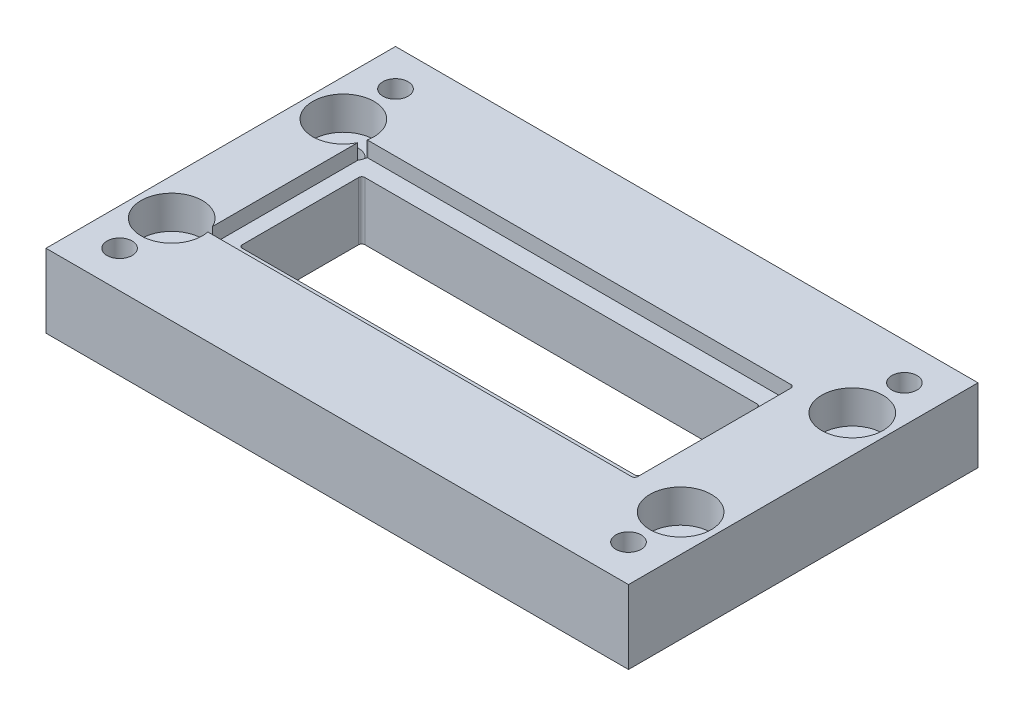
ISO-10303-21;
HEADER;
FILE_DESCRIPTION(('STEP AP214'),'2;1');
FILE_NAME('part.step','',(''),(''),'','','');
FILE_SCHEMA(('AUTOMOTIVE_DESIGN { 1 0 10303 214 1 1 1 1 }'));
ENDSEC;
DATA;
#1=APPLICATION_CONTEXT('core data for automotive mechanical design processes');
#2=APPLICATION_PROTOCOL_DEFINITION('international standard','automotive_design',2000,#1);
#3=PRODUCT_CONTEXT('',#1,'mechanical');
#4=PRODUCT('Part','Part','',(#3));
#5=PRODUCT_RELATED_PRODUCT_CATEGORY('part','',(#4));
#6=PRODUCT_DEFINITION_FORMATION('','',#4);
#7=PRODUCT_DEFINITION_CONTEXT('part definition',#1,'design');
#8=PRODUCT_DEFINITION('design','',#6,#7);
#9=PRODUCT_DEFINITION_SHAPE('','',#8);
#10=(LENGTH_UNIT() NAMED_UNIT(*) SI_UNIT(.MILLI.,.METRE.));
#11=(NAMED_UNIT(*) PLANE_ANGLE_UNIT() SI_UNIT($,.RADIAN.));
#12=(NAMED_UNIT(*) SI_UNIT($,.STERADIAN.) SOLID_ANGLE_UNIT());
#13=UNCERTAINTY_MEASURE_WITH_UNIT(LENGTH_MEASURE(1.E-05),#10,'distance_accuracy_value','');
#14=(GEOMETRIC_REPRESENTATION_CONTEXT(3) GLOBAL_UNCERTAINTY_ASSIGNED_CONTEXT((#13)) GLOBAL_UNIT_ASSIGNED_CONTEXT((#10,
#11,#12)) REPRESENTATION_CONTEXT('',''));
#15=CARTESIAN_POINT('',(0.,0.,0.));
#16=DIRECTION('',(0.,0.,1.));
#17=DIRECTION('',(1.,0.,0.));
#18=AXIS2_PLACEMENT_3D('',#15,#16,#17);
#19=CARTESIAN_POINT('',(-37.,12.,0.));
#20=DIRECTION('',(1.,0.,0.));
#21=DIRECTION('',(0.,0.,-1.));
#22=AXIS2_PLACEMENT_3D('',#19,#20,#21);
#23=PLANE('',#22);
#24=DIRECTION('',(0.,1.,0.));
#25=VECTOR('',#24,1.);
#26=CARTESIAN_POINT('',(-37.,12.,11.8205505282297));
#27=LINE('',#26,#25);
#28=CARTESIAN_POINT('',(-37.,9.5,11.8205505282297));
#29=VERTEX_POINT('',#28);
#30=CARTESIAN_POINT('',(-37.,12.,11.8205505282297));
#31=VERTEX_POINT('',#30);
#32=EDGE_CURVE('E65',#29,#31,#27,.T.);
#33=ORIENTED_EDGE('',*,*,#32,.F.);
#34=DIRECTION('',(0.,0.,1.));
#35=VECTOR('',#34,1.);
#36=CARTESIAN_POINT('',(-37.,9.5,0.));
#37=LINE('',#36,#35);
#38=CARTESIAN_POINT('',(-37.,9.5,-11.8205505282297));
#39=VERTEX_POINT('',#38);
#40=EDGE_CURVE('E352',#39,#29,#37,.T.);
#41=ORIENTED_EDGE('',*,*,#40,.F.);
#42=DIRECTION('',(0.,1.,0.));
#43=VECTOR('',#42,1.);
#44=CARTESIAN_POINT('',(-37.,12.,-11.8205505282297));
#45=LINE('',#44,#43);
#46=CARTESIAN_POINT('',(-37.,12.,-11.8205505282297));
#47=VERTEX_POINT('',#46);
#48=EDGE_CURVE('E58',#47,#39,#45,.F.);
#49=ORIENTED_EDGE('',*,*,#48,.F.);
#50=DIRECTION('',(0.,0.,1.));
#51=VECTOR('',#50,1.);
#52=CARTESIAN_POINT('',(-37.,12.,0.));
#53=LINE('',#52,#51);
#54=EDGE_CURVE('E429',#47,#31,#53,.T.);
#55=ORIENTED_EDGE('',*,*,#54,.T.);
#56=EDGE_LOOP('',(#33,#41,#49,#55));
#57=FACE_BOUND('',#56,.T.);
#58=ADVANCED_FACE('F49',(#57),#23,.T.);
#59=CARTESIAN_POINT('',(-36.5,12.,-12.5));
#60=DIRECTION('',(0.,-1.,0.));
#61=DIRECTION('',(0.,0.,-1.));
#62=AXIS2_PLACEMENT_3D('',#59,#60,#61);
#63=CYLINDRICAL_SURFACE('',#62,0.500000000000003);
#64=CARTESIAN_POINT('',(-36.5,12.,-12.5));
#65=DIRECTION('',(0.,1.,0.));
#66=DIRECTION('',(0.,0.,1.));
#67=AXIS2_PLACEMENT_3D('',#64,#65,#66);
#68=CIRCLE('',#67,0.500000000000003);
#69=CARTESIAN_POINT('',(-36.6032318616067,12.,-12.9892271279776));
#70=VERTEX_POINT('',#69);
#71=CARTESIAN_POINT('',(-36.5,12.,-13.));
#72=VERTEX_POINT('',#71);
#73=EDGE_CURVE('E431',#70,#72,#68,.F.);
#74=ORIENTED_EDGE('',*,*,#73,.F.);
#75=DIRECTION('',(0.,1.,0.));
#76=VECTOR('',#75,1.);
#77=CARTESIAN_POINT('',(-36.6032318616067,10.35,-12.9892271279776));
#78=LINE('',#77,#76);
#79=CARTESIAN_POINT('',(-36.6032318616067,9.5,-12.9892271279776));
#80=VERTEX_POINT('',#79);
#81=EDGE_CURVE('E73',#70,#80,#78,.F.);
#82=ORIENTED_EDGE('',*,*,#81,.T.);
#83=CARTESIAN_POINT('',(-36.5,9.5,-12.5));
#84=DIRECTION('',(0.,1.,0.));
#85=DIRECTION('',(0.,0.,1.));
#86=AXIS2_PLACEMENT_3D('',#83,#84,#85);
#87=CIRCLE('',#86,0.500000000000003);
#88=CARTESIAN_POINT('',(-36.5,9.5,-13.));
#89=VERTEX_POINT('',#88);
#90=EDGE_CURVE('E350',#80,#89,#87,.F.);
#91=ORIENTED_EDGE('',*,*,#90,.T.);
#92=DIRECTION('',(0.,-1.,0.));
#93=VECTOR('',#92,1.);
#94=CARTESIAN_POINT('',(-36.5,12.,-13.));
#95=LINE('',#94,#93);
#96=EDGE_CURVE('E269',#72,#89,#95,.T.);
#97=ORIENTED_EDGE('',*,*,#96,.F.);
#98=EDGE_LOOP('',(#74,#82,#91,#97));
#99=FACE_BOUND('',#98,.T.);
#100=ADVANCED_FACE('F464',(#99),#63,.F.);
#101=CARTESIAN_POINT('',(0.,12.,-13.));
#102=DIRECTION('',(0.,0.,1.));
#103=DIRECTION('',(1.,0.,0.));
#104=AXIS2_PLACEMENT_3D('',#101,#102,#103);
#105=PLANE('',#104);
#106=DIRECTION('',(-1.,0.,0.));
#107=VECTOR('',#106,1.);
#108=CARTESIAN_POINT('',(0.,9.5,-13.));
#109=LINE('',#108,#107);
#110=CARTESIAN_POINT('',(32.5,9.5,-13.));
#111=VERTEX_POINT('',#110);
#112=EDGE_CURVE('E367',#111,#89,#109,.T.);
#113=ORIENTED_EDGE('',*,*,#112,.F.);
#114=DIRECTION('',(0.,-1.,0.));
#115=VECTOR('',#114,1.);
#116=CARTESIAN_POINT('',(32.5,12.,-13.));
#117=LINE('',#116,#115);
#118=CARTESIAN_POINT('',(32.5,12.,-13.));
#119=VERTEX_POINT('',#118);
#120=EDGE_CURVE('E266',#119,#111,#117,.T.);
#121=ORIENTED_EDGE('',*,*,#120,.F.);
#122=DIRECTION('',(-1.,0.,0.));
#123=VECTOR('',#122,1.);
#124=CARTESIAN_POINT('',(0.,12.,-13.));
#125=LINE('',#124,#123);
#126=EDGE_CURVE('E433',#119,#72,#125,.T.);
#127=ORIENTED_EDGE('',*,*,#126,.T.);
#128=ORIENTED_EDGE('',*,*,#96,.T.);
#129=EDGE_LOOP('',(#113,#121,#127,#128));
#130=FACE_BOUND('',#129,.T.);
#131=ADVANCED_FACE('F457',(#130),#105,.T.);
#132=CARTESIAN_POINT('',(32.5,12.,-12.5));
#133=DIRECTION('',(0.,-1.,0.));
#134=DIRECTION('',(0.,0.,-1.));
#135=AXIS2_PLACEMENT_3D('',#132,#133,#134);
#136=CYLINDRICAL_SURFACE('',#135,0.5);
#137=ORIENTED_EDGE('',*,*,#120,.T.);
#138=CARTESIAN_POINT('',(32.5,9.5,-12.5));
#139=DIRECTION('',(0.,1.,0.));
#140=DIRECTION('',(0.,0.,1.));
#141=AXIS2_PLACEMENT_3D('',#138,#139,#140);
#142=CIRCLE('',#141,0.5);
#143=CARTESIAN_POINT('',(33.,9.5,-12.5));
#144=VERTEX_POINT('',#143);
#145=EDGE_CURVE('E364',#111,#144,#142,.F.);
#146=ORIENTED_EDGE('',*,*,#145,.T.);
#147=DIRECTION('',(0.,-1.,0.));
#148=VECTOR('',#147,1.);
#149=CARTESIAN_POINT('',(33.,12.,-12.5));
#150=LINE('',#149,#148);
#151=CARTESIAN_POINT('',(33.,12.,-12.5));
#152=VERTEX_POINT('',#151);
#153=EDGE_CURVE('E263',#152,#144,#150,.T.);
#154=ORIENTED_EDGE('',*,*,#153,.F.);
#155=CARTESIAN_POINT('',(32.5,12.,-12.5));
#156=DIRECTION('',(0.,1.,0.));
#157=DIRECTION('',(0.,0.,1.));
#158=AXIS2_PLACEMENT_3D('',#155,#156,#157);
#159=CIRCLE('',#158,0.5);
#160=EDGE_CURVE('E436',#119,#152,#159,.F.);
#161=ORIENTED_EDGE('',*,*,#160,.F.);
#162=EDGE_LOOP('',(#137,#146,#154,#161));
#163=FACE_BOUND('',#162,.T.);
#164=ADVANCED_FACE('F455',(#163),#136,.F.);
#165=CARTESIAN_POINT('',(33.,12.,0.));
#166=DIRECTION('',(1.,0.,0.));
#167=DIRECTION('',(0.,0.,-1.));
#168=AXIS2_PLACEMENT_3D('',#165,#166,#167);
#169=PLANE('',#168);
#170=ORIENTED_EDGE('',*,*,#153,.T.);
#171=DIRECTION('',(0.,0.,1.));
#172=VECTOR('',#171,1.);
#173=CARTESIAN_POINT('',(33.,9.5,0.));
#174=LINE('',#173,#172);
#175=CARTESIAN_POINT('',(33.,9.5,12.5));
#176=VERTEX_POINT('',#175);
#177=EDGE_CURVE('E361',#144,#176,#174,.T.);
#178=ORIENTED_EDGE('',*,*,#177,.T.);
#179=DIRECTION('',(0.,-1.,0.));
#180=VECTOR('',#179,1.);
#181=CARTESIAN_POINT('',(33.,12.,12.5));
#182=LINE('',#181,#180);
#183=CARTESIAN_POINT('',(33.,12.,12.5));
#184=VERTEX_POINT('',#183);
#185=EDGE_CURVE('E260',#184,#176,#182,.T.);
#186=ORIENTED_EDGE('',*,*,#185,.F.);
#187=DIRECTION('',(0.,0.,1.));
#188=VECTOR('',#187,1.);
#189=CARTESIAN_POINT('',(33.,12.,0.));
#190=LINE('',#189,#188);
#191=EDGE_CURVE('E439',#152,#184,#190,.T.);
#192=ORIENTED_EDGE('',*,*,#191,.F.);
#193=EDGE_LOOP('',(#170,#178,#186,#192));
#194=FACE_BOUND('',#193,.T.);
#195=ADVANCED_FACE('F449',(#194),#169,.F.);
#196=CARTESIAN_POINT('',(32.5,12.,12.5));
#197=DIRECTION('',(0.,-1.,0.));
#198=DIRECTION('',(0.,0.,-1.));
#199=AXIS2_PLACEMENT_3D('',#196,#197,#198);
#200=CYLINDRICAL_SURFACE('',#199,0.5);
#201=CARTESIAN_POINT('',(32.5,9.5,12.5));
#202=DIRECTION('',(0.,1.,0.));
#203=DIRECTION('',(0.,0.,1.));
#204=AXIS2_PLACEMENT_3D('',#201,#202,#203);
#205=CIRCLE('',#204,0.5);
#206=CARTESIAN_POINT('',(32.5,9.5,13.));
#207=VERTEX_POINT('',#206);
#208=EDGE_CURVE('E359',#207,#176,#205,.T.);
#209=ORIENTED_EDGE('',*,*,#208,.F.);
#210=DIRECTION('',(0.,-1.,0.));
#211=VECTOR('',#210,1.);
#212=CARTESIAN_POINT('',(32.5,12.,13.));
#213=LINE('',#212,#211);
#214=CARTESIAN_POINT('',(32.5,12.,13.));
#215=VERTEX_POINT('',#214);
#216=EDGE_CURVE('E256',#215,#207,#213,.T.);
#217=ORIENTED_EDGE('',*,*,#216,.F.);
#218=CARTESIAN_POINT('',(32.5,12.,12.5));
#219=DIRECTION('',(0.,1.,0.));
#220=DIRECTION('',(0.,0.,1.));
#221=AXIS2_PLACEMENT_3D('',#218,#219,#220);
#222=CIRCLE('',#221,0.5);
#223=EDGE_CURVE('E224',#215,#184,#222,.T.);
#224=ORIENTED_EDGE('',*,*,#223,.T.);
#225=ORIENTED_EDGE('',*,*,#185,.T.);
#226=EDGE_LOOP('',(#209,#217,#224,#225));
#227=FACE_BOUND('',#226,.T.);
#228=ADVANCED_FACE('F443',(#227),#200,.F.);
#229=CARTESIAN_POINT('',(0.,12.,13.));
#230=DIRECTION('',(0.,0.,1.));
#231=DIRECTION('',(1.,0.,0.));
#232=AXIS2_PLACEMENT_3D('',#229,#230,#231);
#233=PLANE('',#232);
#234=ORIENTED_EDGE('',*,*,#216,.T.);
#235=DIRECTION('',(-1.,0.,0.));
#236=VECTOR('',#235,1.);
#237=CARTESIAN_POINT('',(0.,9.5,13.));
#238=LINE('',#237,#236);
#239=CARTESIAN_POINT('',(-36.5,9.5,13.));
#240=VERTEX_POINT('',#239);
#241=EDGE_CURVE('E356',#207,#240,#238,.T.);
#242=ORIENTED_EDGE('',*,*,#241,.T.);
#243=DIRECTION('',(0.,-1.,0.));
#244=VECTOR('',#243,1.);
#245=CARTESIAN_POINT('',(-36.5,12.,13.));
#246=LINE('',#245,#244);
#247=CARTESIAN_POINT('',(-36.5,12.,13.));
#248=VERTEX_POINT('',#247);
#249=EDGE_CURVE('E254',#248,#240,#246,.T.);
#250=ORIENTED_EDGE('',*,*,#249,.F.);
#251=DIRECTION('',(-1.,0.,0.));
#252=VECTOR('',#251,1.);
#253=CARTESIAN_POINT('',(0.,12.,13.));
#254=LINE('',#253,#252);
#255=EDGE_CURVE('E218',#215,#248,#254,.T.);
#256=ORIENTED_EDGE('',*,*,#255,.F.);
#257=EDGE_LOOP('',(#234,#242,#250,#256));
#258=FACE_BOUND('',#257,.T.);
#259=ADVANCED_FACE('F470',(#258),#233,.F.);
#260=CARTESIAN_POINT('',(0.,12.,-28.5));
#261=DIRECTION('',(0.,0.,1.));
#262=DIRECTION('',(1.,0.,0.));
#263=AXIS2_PLACEMENT_3D('',#260,#261,#262);
#264=PLANE('',#263);
#265=DIRECTION('',(-1.,0.,0.));
#266=VECTOR('',#265,1.);
#267=CARTESIAN_POINT('',(0.,0.,-28.5));
#268=LINE('',#267,#266);
#269=CARTESIAN_POINT('',(47.5,0.,-28.5));
#270=VERTEX_POINT('',#269);
#271=CARTESIAN_POINT('',(-47.5,0.,-28.5));
#272=VERTEX_POINT('',#271);
#273=EDGE_CURVE('E241',#270,#272,#268,.T.);
#274=ORIENTED_EDGE('',*,*,#273,.T.);
#275=DIRECTION('',(0.,-1.,0.));
#276=VECTOR('',#275,1.);
#277=CARTESIAN_POINT('',(-47.5,12.,-28.5));
#278=LINE('',#277,#276);
#279=CARTESIAN_POINT('',(-47.5,12.,-28.5));
#280=VERTEX_POINT('',#279);
#281=EDGE_CURVE('E257',#280,#272,#278,.T.);
#282=ORIENTED_EDGE('',*,*,#281,.F.);
#283=DIRECTION('',(-1.,0.,0.));
#284=VECTOR('',#283,1.);
#285=CARTESIAN_POINT('',(0.,12.,-28.5));
#286=LINE('',#285,#284);
#287=CARTESIAN_POINT('',(47.5,12.,-28.5));
#288=VERTEX_POINT('',#287);
#289=EDGE_CURVE('E418',#288,#280,#286,.T.);
#290=ORIENTED_EDGE('',*,*,#289,.F.);
#291=DIRECTION('',(0.,-1.,0.));
#292=VECTOR('',#291,1.);
#293=CARTESIAN_POINT('',(47.5,12.,-28.5));
#294=LINE('',#293,#292);
#295=EDGE_CURVE('E220',#288,#270,#294,.T.);
#296=ORIENTED_EDGE('',*,*,#295,.T.);
#297=EDGE_LOOP('',(#274,#282,#290,#296));
#298=FACE_BOUND('',#297,.T.);
#299=ADVANCED_FACE('F472',(#298),#264,.F.);
#300=CARTESIAN_POINT('',(-47.5,12.,0.));
#301=DIRECTION('',(1.,0.,0.));
#302=DIRECTION('',(0.,0.,-1.));
#303=AXIS2_PLACEMENT_3D('',#300,#301,#302);
#304=PLANE('',#303);
#305=DIRECTION('',(0.,0.,1.));
#306=VECTOR('',#305,1.);
#307=CARTESIAN_POINT('',(-47.5,0.,0.));
#308=LINE('',#307,#306);
#309=CARTESIAN_POINT('',(-47.5,0.,28.5));
#310=VERTEX_POINT('',#309);
#311=EDGE_CURVE('E244',#272,#310,#308,.T.);
#312=ORIENTED_EDGE('',*,*,#311,.T.);
#313=DIRECTION('',(0.,-1.,0.));
#314=VECTOR('',#313,1.);
#315=CARTESIAN_POINT('',(-47.5,12.,28.5));
#316=LINE('',#315,#314);
#317=CARTESIAN_POINT('',(-47.5,12.,28.5));
#318=VERTEX_POINT('',#317);
#319=EDGE_CURVE('E274',#318,#310,#316,.T.);
#320=ORIENTED_EDGE('',*,*,#319,.F.);
#321=DIRECTION('',(0.,0.,1.));
#322=VECTOR('',#321,1.);
#323=CARTESIAN_POINT('',(-47.5,12.,0.));
#324=LINE('',#323,#322);
#325=EDGE_CURVE('E421',#280,#318,#324,.T.);
#326=ORIENTED_EDGE('',*,*,#325,.F.);
#327=ORIENTED_EDGE('',*,*,#281,.T.);
#328=EDGE_LOOP('',(#312,#320,#326,#327));
#329=FACE_BOUND('',#328,.T.);
#330=ADVANCED_FACE('F478',(#329),#304,.F.);
#331=CARTESIAN_POINT('',(0.,12.,28.5));
#332=DIRECTION('',(0.,0.,1.));
#333=DIRECTION('',(1.,0.,0.));
#334=AXIS2_PLACEMENT_3D('',#331,#332,#333);
#335=PLANE('',#334);
#336=DIRECTION('',(-1.,0.,0.));
#337=VECTOR('',#336,1.);
#338=CARTESIAN_POINT('',(0.,0.,28.5));
#339=LINE('',#338,#337);
#340=CARTESIAN_POINT('',(47.5,0.,28.5));
#341=VERTEX_POINT('',#340);
#342=EDGE_CURVE('E247',#341,#310,#339,.T.);
#343=ORIENTED_EDGE('',*,*,#342,.F.);
#344=DIRECTION('',(0.,-1.,0.));
#345=VECTOR('',#344,1.);
#346=CARTESIAN_POINT('',(47.5,12.,28.5));
#347=LINE('',#346,#345);
#348=CARTESIAN_POINT('',(47.5,12.,28.5));
#349=VERTEX_POINT('',#348);
#350=EDGE_CURVE('E222',#349,#341,#347,.T.);
#351=ORIENTED_EDGE('',*,*,#350,.F.);
#352=DIRECTION('',(-1.,0.,0.));
#353=VECTOR('',#352,1.);
#354=CARTESIAN_POINT('',(0.,12.,28.5));
#355=LINE('',#354,#353);
#356=EDGE_CURVE('E423',#349,#318,#355,.T.);
#357=ORIENTED_EDGE('',*,*,#356,.T.);
#358=ORIENTED_EDGE('',*,*,#319,.T.);
#359=EDGE_LOOP('',(#343,#351,#357,#358));
#360=FACE_BOUND('',#359,.T.);
#361=ADVANCED_FACE('F495',(#360),#335,.T.);
#362=CARTESIAN_POINT('',(47.5,12.,0.));
#363=DIRECTION('',(1.,0.,0.));
#364=DIRECTION('',(0.,0.,-1.));
#365=AXIS2_PLACEMENT_3D('',#362,#363,#364);
#366=PLANE('',#365);
#367=DIRECTION('',(0.,0.,1.));
#368=VECTOR('',#367,1.);
#369=CARTESIAN_POINT('',(47.5,0.,0.));
#370=LINE('',#369,#368);
#371=EDGE_CURVE('E250',#270,#341,#370,.T.);
#372=ORIENTED_EDGE('',*,*,#371,.F.);
#373=ORIENTED_EDGE('',*,*,#295,.F.);
#374=DIRECTION('',(0.,0.,1.));
#375=VECTOR('',#374,1.);
#376=CARTESIAN_POINT('',(47.5,12.,0.));
#377=LINE('',#376,#375);
#378=EDGE_CURVE('E426',#288,#349,#377,.T.);
#379=ORIENTED_EDGE('',*,*,#378,.T.);
#380=ORIENTED_EDGE('',*,*,#350,.T.);
#381=EDGE_LOOP('',(#372,#373,#379,#380));
#382=FACE_BOUND('',#381,.T.);
#383=ADVANCED_FACE('F491',(#382),#366,.T.);
#384=CARTESIAN_POINT('',(-41.5,12.,22.5));
#385=DIRECTION('',(0.,-1.,0.));
#386=DIRECTION('',(0.,0.,-1.));
#387=AXIS2_PLACEMENT_3D('',#384,#385,#386);
#388=CYLINDRICAL_SURFACE('',#387,2.05798302171012);
#389=CARTESIAN_POINT('',(-41.5,12.,22.5));
#390=DIRECTION('',(0.,1.,0.));
#391=DIRECTION('',(0.,0.,1.));
#392=AXIS2_PLACEMENT_3D('',#389,#390,#391);
#393=CIRCLE('',#392,2.05798302171012);
#394=CARTESIAN_POINT('',(-41.5,12.,24.5579830217101));
#395=VERTEX_POINT('',#394);
#396=EDGE_CURVE('E415',#395,#395,#393,.T.);
#397=ORIENTED_EDGE('',*,*,#396,.T.);
#398=EDGE_LOOP('',(#397));
#399=FACE_BOUND('',#398,.T.);
#400=CARTESIAN_POINT('',(-41.5,0.,22.5));
#401=DIRECTION('',(0.,1.,0.));
#402=DIRECTION('',(0.,0.,1.));
#403=AXIS2_PLACEMENT_3D('',#400,#401,#402);
#404=CIRCLE('',#403,2.05798302171012);
#405=CARTESIAN_POINT('',(-41.5,0.,24.5579830217101));
#406=VERTEX_POINT('',#405);
#407=EDGE_CURVE('E238',#406,#406,#404,.T.);
#408=ORIENTED_EDGE('',*,*,#407,.F.);
#409=EDGE_LOOP('',(#408));
#410=FACE_BOUND('',#409,.T.);
#411=ADVANCED_FACE('F494',(#399,#410),#388,.F.);
#412=CARTESIAN_POINT('',(41.5,12.,22.5));
#413=DIRECTION('',(0.,-1.,0.));
#414=DIRECTION('',(0.,0.,-1.));
#415=AXIS2_PLACEMENT_3D('',#412,#413,#414);
#416=CYLINDRICAL_SURFACE('',#415,2.05798302171012);
#417=CARTESIAN_POINT('',(41.5,12.,22.5));
#418=DIRECTION('',(0.,1.,0.));
#419=DIRECTION('',(0.,0.,1.));
#420=AXIS2_PLACEMENT_3D('',#417,#418,#419);
#421=CIRCLE('',#420,2.05798302171012);
#422=CARTESIAN_POINT('',(41.5,12.,24.5579830217101));
#423=VERTEX_POINT('',#422);
#424=EDGE_CURVE('E412',#423,#423,#421,.T.);
#425=ORIENTED_EDGE('',*,*,#424,.T.);
#426=EDGE_LOOP('',(#425));
#427=FACE_BOUND('',#426,.T.);
#428=CARTESIAN_POINT('',(41.5,0.,22.5));
#429=DIRECTION('',(0.,1.,0.));
#430=DIRECTION('',(0.,0.,1.));
#431=AXIS2_PLACEMENT_3D('',#428,#429,#430);
#432=CIRCLE('',#431,2.05798302171012);
#433=CARTESIAN_POINT('',(41.5,0.,24.5579830217101));
#434=VERTEX_POINT('',#433);
#435=EDGE_CURVE('E235',#434,#434,#432,.T.);
#436=ORIENTED_EDGE('',*,*,#435,.F.);
#437=EDGE_LOOP('',(#436));
#438=FACE_BOUND('',#437,.T.);
#439=ADVANCED_FACE('F505',(#427,#438),#416,.F.);
#440=CARTESIAN_POINT('',(-41.5,12.,-22.5));
#441=DIRECTION('',(0.,-1.,0.));
#442=DIRECTION('',(0.,0.,-1.));
#443=AXIS2_PLACEMENT_3D('',#440,#441,#442);
#444=CYLINDRICAL_SURFACE('',#443,2.05798302171012);
#445=CARTESIAN_POINT('',(-41.5,12.,-22.5));
#446=DIRECTION('',(0.,1.,0.));
#447=DIRECTION('',(0.,0.,1.));
#448=AXIS2_PLACEMENT_3D('',#445,#446,#447);
#449=CIRCLE('',#448,2.05798302171012);
#450=CARTESIAN_POINT('',(-41.5,12.,-20.4420169782899));
#451=VERTEX_POINT('',#450);
#452=EDGE_CURVE('E409',#451,#451,#449,.T.);
#453=ORIENTED_EDGE('',*,*,#452,.T.);
#454=EDGE_LOOP('',(#453));
#455=FACE_BOUND('',#454,.T.);
#456=CARTESIAN_POINT('',(-41.5,0.,-22.5));
#457=DIRECTION('',(0.,1.,0.));
#458=DIRECTION('',(0.,0.,1.));
#459=AXIS2_PLACEMENT_3D('',#456,#457,#458);
#460=CIRCLE('',#459,2.05798302171012);
#461=CARTESIAN_POINT('',(-41.5,0.,-20.4420169782899));
#462=VERTEX_POINT('',#461);
#463=EDGE_CURVE('E231',#462,#462,#460,.T.);
#464=ORIENTED_EDGE('',*,*,#463,.F.);
#465=EDGE_LOOP('',(#464));
#466=FACE_BOUND('',#465,.T.);
#467=ADVANCED_FACE('F508',(#455,#466),#444,.F.);
#468=CARTESIAN_POINT('',(41.5,12.,-22.5));
#469=DIRECTION('',(0.,-1.,0.));
#470=DIRECTION('',(0.,0.,-1.));
#471=AXIS2_PLACEMENT_3D('',#468,#469,#470);
#472=CYLINDRICAL_SURFACE('',#471,2.05798302171012);
#473=CARTESIAN_POINT('',(41.5,12.,-22.5));
#474=DIRECTION('',(0.,1.,0.));
#475=DIRECTION('',(0.,0.,1.));
#476=AXIS2_PLACEMENT_3D('',#473,#474,#475);
#477=CIRCLE('',#476,2.05798302171012);
#478=CARTESIAN_POINT('',(41.5,12.,-20.4420169782899));
#479=VERTEX_POINT('',#478);
#480=EDGE_CURVE('E253',#479,#479,#477,.T.);
#481=ORIENTED_EDGE('',*,*,#480,.T.);
#482=EDGE_LOOP('',(#481));
#483=FACE_BOUND('',#482,.T.);
#484=CARTESIAN_POINT('',(41.5,0.,-22.5));
#485=DIRECTION('',(0.,1.,0.));
#486=DIRECTION('',(0.,0.,1.));
#487=AXIS2_PLACEMENT_3D('',#484,#485,#486);
#488=CIRCLE('',#487,2.05798302171012);
#489=CARTESIAN_POINT('',(41.5,0.,-20.4420169782899));
#490=VERTEX_POINT('',#489);
#491=EDGE_CURVE('E228',#490,#490,#488,.T.);
#492=ORIENTED_EDGE('',*,*,#491,.F.);
#493=EDGE_LOOP('',(#492));
#494=FACE_BOUND('',#493,.T.);
#495=ADVANCED_FACE('F51',(#483,#494),#472,.F.);
#496=CARTESIAN_POINT('',(-36.5,12.,12.5));
#497=DIRECTION('',(0.,-1.,0.));
#498=DIRECTION('',(0.,0.,-1.));
#499=AXIS2_PLACEMENT_3D('',#496,#497,#498);
#500=CYLINDRICAL_SURFACE('',#499,0.5);
#501=CARTESIAN_POINT('',(-36.5,9.5,12.5));
#502=DIRECTION('',(0.,1.,0.));
#503=DIRECTION('',(0.,0.,1.));
#504=AXIS2_PLACEMENT_3D('',#501,#502,#503);
#505=CIRCLE('',#504,0.5);
#506=CARTESIAN_POINT('',(-36.6032318616067,9.5,12.9892271279776));
#507=VERTEX_POINT('',#506);
#508=EDGE_CURVE('E211',#240,#507,#505,.F.);
#509=ORIENTED_EDGE('',*,*,#508,.T.);
#510=DIRECTION('',(0.,1.,0.));
#511=VECTOR('',#510,1.);
#512=CARTESIAN_POINT('',(-36.6032318616067,10.35,12.9892271279776));
#513=LINE('',#512,#511);
#514=CARTESIAN_POINT('',(-36.6032318616067,12.,12.9892271279776));
#515=VERTEX_POINT('',#514);
#516=EDGE_CURVE('E199',#507,#515,#513,.T.);
#517=ORIENTED_EDGE('',*,*,#516,.T.);
#518=CARTESIAN_POINT('',(-36.5,12.,12.5));
#519=DIRECTION('',(0.,1.,0.));
#520=DIRECTION('',(0.,0.,1.));
#521=AXIS2_PLACEMENT_3D('',#518,#519,#520);
#522=CIRCLE('',#521,0.5);
#523=EDGE_CURVE('E209',#248,#515,#522,.F.);
#524=ORIENTED_EDGE('',*,*,#523,.F.);
#525=ORIENTED_EDGE('',*,*,#249,.T.);
#526=EDGE_LOOP('',(#509,#517,#524,#525));
#527=FACE_BOUND('',#526,.T.);
#528=ADVANCED_FACE('F207',(#527),#500,.F.);
#529=CARTESIAN_POINT('',(0.,12.,0.));
#530=DIRECTION('',(0.,1.,0.));
#531=DIRECTION('',(0.,0.,1.));
#532=AXIS2_PLACEMENT_3D('',#529,#530,#531);
#533=PLANE('',#532);
#534=CARTESIAN_POINT('',(41.5,12.,14.));
#535=DIRECTION('',(0.,1.,0.));
#536=DIRECTION('',(0.,0.,1.));
#537=AXIS2_PLACEMENT_3D('',#534,#535,#536);
#538=CIRCLE('',#537,5.);
#539=CARTESIAN_POINT('',(41.5,12.,19.));
#540=VERTEX_POINT('',#539);
#541=EDGE_CURVE('E284',#540,#540,#538,.T.);
#542=ORIENTED_EDGE('',*,*,#541,.F.);
#543=EDGE_LOOP('',(#542));
#544=FACE_BOUND('',#543,.T.);
#545=CARTESIAN_POINT('',(41.5,12.,-14.));
#546=DIRECTION('',(0.,1.,0.));
#547=DIRECTION('',(0.,0.,1.));
#548=AXIS2_PLACEMENT_3D('',#545,#546,#547);
#549=CIRCLE('',#548,5.);
#550=CARTESIAN_POINT('',(41.5,12.,-9.00000000000001));
#551=VERTEX_POINT('',#550);
#552=EDGE_CURVE('E283',#551,#551,#549,.T.);
#553=ORIENTED_EDGE('',*,*,#552,.F.);
#554=EDGE_LOOP('',(#553));
#555=FACE_BOUND('',#554,.T.);
#556=CARTESIAN_POINT('',(-41.5,12.,14.));
#557=DIRECTION('',(0.,1.,0.));
#558=DIRECTION('',(0.,0.,1.));
#559=AXIS2_PLACEMENT_3D('',#556,#557,#558);
#560=CIRCLE('',#559,5.);
#561=EDGE_CURVE('E13',#31,#515,#560,.T.);
#562=ORIENTED_EDGE('',*,*,#561,.F.);
#563=ORIENTED_EDGE('',*,*,#54,.F.);
#564=CARTESIAN_POINT('',(-41.5,12.,-14.));
#565=DIRECTION('',(0.,1.,0.));
#566=DIRECTION('',(0.,0.,1.));
#567=AXIS2_PLACEMENT_3D('',#564,#565,#566);
#568=CIRCLE('',#567,5.);
#569=EDGE_CURVE('E271',#70,#47,#568,.T.);
#570=ORIENTED_EDGE('',*,*,#569,.F.);
#571=ORIENTED_EDGE('',*,*,#73,.T.);
#572=ORIENTED_EDGE('',*,*,#126,.F.);
#573=ORIENTED_EDGE('',*,*,#160,.T.);
#574=ORIENTED_EDGE('',*,*,#191,.T.);
#575=ORIENTED_EDGE('',*,*,#223,.F.);
#576=ORIENTED_EDGE('',*,*,#255,.T.);
#577=ORIENTED_EDGE('',*,*,#523,.T.);
#578=EDGE_LOOP('',(#562,#563,#570,#571,#572,#573,#574,#575,#576,#577));
#579=FACE_BOUND('',#578,.T.);
#580=ORIENTED_EDGE('',*,*,#480,.F.);
#581=EDGE_LOOP('',(#580));
#582=FACE_BOUND('',#581,.T.);
#583=ORIENTED_EDGE('',*,*,#452,.F.);
#584=EDGE_LOOP('',(#583));
#585=FACE_BOUND('',#584,.T.);
#586=ORIENTED_EDGE('',*,*,#424,.F.);
#587=EDGE_LOOP('',(#586));
#588=FACE_BOUND('',#587,.T.);
#589=ORIENTED_EDGE('',*,*,#396,.F.);
#590=EDGE_LOOP('',(#589));
#591=FACE_BOUND('',#590,.T.);
#592=ORIENTED_EDGE('',*,*,#289,.T.);
#593=ORIENTED_EDGE('',*,*,#325,.T.);
#594=ORIENTED_EDGE('',*,*,#356,.F.);
#595=ORIENTED_EDGE('',*,*,#378,.F.);
#596=EDGE_LOOP('',(#592,#593,#594,#595));
#597=FACE_BOUND('',#596,.T.);
#598=ADVANCED_FACE('F214',(#544,#555,#579,#582,#585,#588,#591,#597),#533,.T.);
#599=CARTESIAN_POINT('',(0.,0.,0.));
#600=DIRECTION('',(0.,1.,0.));
#601=DIRECTION('',(0.,0.,1.));
#602=AXIS2_PLACEMENT_3D('',#599,#600,#601);
#603=PLANE('',#602);
#604=CARTESIAN_POINT('',(41.5,0.,-14.));
#605=DIRECTION('',(0.,1.,0.));
#606=DIRECTION('',(0.,0.,1.));
#607=AXIS2_PLACEMENT_3D('',#604,#605,#606);
#608=CIRCLE('',#607,2.5);
#609=CARTESIAN_POINT('',(41.5,0.,-11.5));
#610=VERTEX_POINT('',#609);
#611=EDGE_CURVE('E315',#610,#610,#608,.T.);
#612=ORIENTED_EDGE('',*,*,#611,.T.);
#613=EDGE_LOOP('',(#612));
#614=FACE_BOUND('',#613,.T.);
#615=CARTESIAN_POINT('',(41.5,0.,14.));
#616=DIRECTION('',(0.,1.,0.));
#617=DIRECTION('',(0.,0.,1.));
#618=AXIS2_PLACEMENT_3D('',#615,#616,#617);
#619=CIRCLE('',#618,2.5);
#620=CARTESIAN_POINT('',(41.5,0.,16.5));
#621=VERTEX_POINT('',#620);
#622=EDGE_CURVE('E320',#621,#621,#619,.T.);
#623=ORIENTED_EDGE('',*,*,#622,.T.);
#624=EDGE_LOOP('',(#623));
#625=FACE_BOUND('',#624,.T.);
#626=CARTESIAN_POINT('',(-41.5,0.,14.));
#627=DIRECTION('',(0.,1.,0.));
#628=DIRECTION('',(0.,0.,1.));
#629=AXIS2_PLACEMENT_3D('',#626,#627,#628);
#630=CIRCLE('',#629,2.5);
#631=CARTESIAN_POINT('',(-41.5,0.,16.5));
#632=VERTEX_POINT('',#631);
#633=EDGE_CURVE('E316',#632,#632,#630,.T.);
#634=ORIENTED_EDGE('',*,*,#633,.T.);
#635=EDGE_LOOP('',(#634));
#636=FACE_BOUND('',#635,.T.);
#637=CARTESIAN_POINT('',(-41.5,0.,-14.));
#638=DIRECTION('',(0.,1.,0.));
#639=DIRECTION('',(0.,0.,1.));
#640=AXIS2_PLACEMENT_3D('',#637,#638,#639);
#641=CIRCLE('',#640,2.5);
#642=CARTESIAN_POINT('',(-41.5,0.,-11.5));
#643=VERTEX_POINT('',#642);
#644=EDGE_CURVE('E319',#643,#643,#641,.T.);
#645=ORIENTED_EDGE('',*,*,#644,.T.);
#646=EDGE_LOOP('',(#645));
#647=FACE_BOUND('',#646,.T.);
#648=ORIENTED_EDGE('',*,*,#491,.T.);
#649=EDGE_LOOP('',(#648));
#650=FACE_BOUND('',#649,.T.);
#651=ORIENTED_EDGE('',*,*,#463,.T.);
#652=EDGE_LOOP('',(#651));
#653=FACE_BOUND('',#652,.T.);
#654=ORIENTED_EDGE('',*,*,#435,.T.);
#655=EDGE_LOOP('',(#654));
#656=FACE_BOUND('',#655,.T.);
#657=ORIENTED_EDGE('',*,*,#407,.T.);
#658=EDGE_LOOP('',(#657));
#659=FACE_BOUND('',#658,.T.);
#660=ORIENTED_EDGE('',*,*,#273,.F.);
#661=ORIENTED_EDGE('',*,*,#371,.T.);
#662=ORIENTED_EDGE('',*,*,#342,.T.);
#663=ORIENTED_EDGE('',*,*,#311,.F.);
#664=EDGE_LOOP('',(#660,#661,#662,#663));
#665=FACE_BOUND('',#664,.T.);
#666=CARTESIAN_POINT('',(30.,0.,9.49999999999999));
#667=DIRECTION('',(0.,1.,0.));
#668=DIRECTION('',(0.,0.,1.));
#669=AXIS2_PLACEMENT_3D('',#666,#667,#668);
#670=CIRCLE('',#669,0.5);
#671=CARTESIAN_POINT('',(30.,0.,9.99999999999999));
#672=VERTEX_POINT('',#671);
#673=CARTESIAN_POINT('',(30.5,0.,9.49999999999999));
#674=VERTEX_POINT('',#673);
#675=EDGE_CURVE('E327',#672,#674,#670,.T.);
#676=ORIENTED_EDGE('',*,*,#675,.T.);
#677=DIRECTION('',(0.,0.,-1.));
#678=VECTOR('',#677,1.);
#679=CARTESIAN_POINT('',(30.5,0.,0.));
#680=LINE('',#679,#678);
#681=CARTESIAN_POINT('',(30.5,0.,-9.5));
#682=VERTEX_POINT('',#681);
#683=EDGE_CURVE('E332',#674,#682,#680,.T.);
#684=ORIENTED_EDGE('',*,*,#683,.T.);
#685=CARTESIAN_POINT('',(30.,0.,-9.50000000000001));
#686=DIRECTION('',(0.,1.,0.));
#687=DIRECTION('',(0.,0.,1.));
#688=AXIS2_PLACEMENT_3D('',#685,#686,#687);
#689=CIRCLE('',#688,0.5);
#690=CARTESIAN_POINT('',(30.,0.,-10.));
#691=VERTEX_POINT('',#690);
#692=EDGE_CURVE('E386',#682,#691,#689,.T.);
#693=ORIENTED_EDGE('',*,*,#692,.T.);
#694=DIRECTION('',(-1.,0.,0.));
#695=VECTOR('',#694,1.);
#696=CARTESIAN_POINT('',(0.,0.,-10.));
#697=LINE('',#696,#695);
#698=CARTESIAN_POINT('',(-34.,0.,-10.));
#699=VERTEX_POINT('',#698);
#700=EDGE_CURVE('E383',#691,#699,#697,.T.);
#701=ORIENTED_EDGE('',*,*,#700,.T.);
#702=CARTESIAN_POINT('',(-34.,0.,-9.5));
#703=DIRECTION('',(0.,1.,0.));
#704=DIRECTION('',(0.,0.,1.));
#705=AXIS2_PLACEMENT_3D('',#702,#703,#704);
#706=CIRCLE('',#705,0.5);
#707=CARTESIAN_POINT('',(-34.5,0.,-9.49999999999999));
#708=VERTEX_POINT('',#707);
#709=EDGE_CURVE('E380',#699,#708,#706,.T.);
#710=ORIENTED_EDGE('',*,*,#709,.T.);
#711=DIRECTION('',(0.,0.,-1.));
#712=VECTOR('',#711,1.);
#713=CARTESIAN_POINT('',(-34.5,0.,0.));
#714=LINE('',#713,#712);
#715=CARTESIAN_POINT('',(-34.5,0.,9.5));
#716=VERTEX_POINT('',#715);
#717=EDGE_CURVE('E377',#716,#708,#714,.T.);
#718=ORIENTED_EDGE('',*,*,#717,.F.);
#719=CARTESIAN_POINT('',(-34.,0.,9.5));
#720=DIRECTION('',(0.,1.,0.));
#721=DIRECTION('',(0.,0.,1.));
#722=AXIS2_PLACEMENT_3D('',#719,#720,#721);
#723=CIRCLE('',#722,0.5);
#724=CARTESIAN_POINT('',(-34.,0.,10.));
#725=VERTEX_POINT('',#724);
#726=EDGE_CURVE('E375',#725,#716,#723,.F.);
#727=ORIENTED_EDGE('',*,*,#726,.F.);
#728=DIRECTION('',(-1.,0.,0.));
#729=VECTOR('',#728,1.);
#730=CARTESIAN_POINT('',(0.,0.,10.));
#731=LINE('',#730,#729);
#732=EDGE_CURVE('E373',#672,#725,#731,.T.);
#733=ORIENTED_EDGE('',*,*,#732,.F.);
#734=EDGE_LOOP('',(#676,#684,#693,#701,#710,#718,#727,#733));
#735=FACE_BOUND('',#734,.T.);
#736=ADVANCED_FACE('F520',(#614,#625,#636,#647,#650,#653,#656,#659,#665,#735),#603,.F.);
#737=CARTESIAN_POINT('',(30.,9.5,9.49999999999999));
#738=DIRECTION('',(0.,-1.,0.));
#739=DIRECTION('',(0.,0.,-1.));
#740=AXIS2_PLACEMENT_3D('',#737,#738,#739);
#741=CYLINDRICAL_SURFACE('',#740,0.5);
#742=ORIENTED_EDGE('',*,*,#675,.F.);
#743=DIRECTION('',(0.,-1.,0.));
#744=VECTOR('',#743,1.);
#745=CARTESIAN_POINT('',(30.,9.5,9.99999999999999));
#746=LINE('',#745,#744);
#747=CARTESIAN_POINT('',(30.,9.5,9.99999999999999));
#748=VERTEX_POINT('',#747);
#749=EDGE_CURVE('E232',#748,#672,#746,.T.);
#750=ORIENTED_EDGE('',*,*,#749,.F.);
#751=CARTESIAN_POINT('',(30.,9.5,9.49999999999999));
#752=DIRECTION('',(0.,1.,0.));
#753=DIRECTION('',(0.,0.,1.));
#754=AXIS2_PLACEMENT_3D('',#751,#752,#753);
#755=CIRCLE('',#754,0.5);
#756=CARTESIAN_POINT('',(30.5,9.5,9.49999999999999));
#757=VERTEX_POINT('',#756);
#758=EDGE_CURVE('E328',#748,#757,#755,.T.);
#759=ORIENTED_EDGE('',*,*,#758,.T.);
#760=DIRECTION('',(0.,-1.,0.));
#761=VECTOR('',#760,1.);
#762=CARTESIAN_POINT('',(30.5,9.5,9.49999999999999));
#763=LINE('',#762,#761);
#764=EDGE_CURVE('E370',#757,#674,#763,.T.);
#765=ORIENTED_EDGE('',*,*,#764,.T.);
#766=EDGE_LOOP('',(#742,#750,#759,#765));
#767=FACE_BOUND('',#766,.T.);
#768=ADVANCED_FACE('F523',(#767),#741,.F.);
#769=CARTESIAN_POINT('',(0.,9.5,10.));
#770=DIRECTION('',(0.,0.,1.));
#771=DIRECTION('',(1.,0.,0.));
#772=AXIS2_PLACEMENT_3D('',#769,#770,#771);
#773=PLANE('',#772);
#774=ORIENTED_EDGE('',*,*,#732,.T.);
#775=DIRECTION('',(0.,-1.,0.));
#776=VECTOR('',#775,1.);
#777=CARTESIAN_POINT('',(-34.,9.5,10.));
#778=LINE('',#777,#776);
#779=CARTESIAN_POINT('',(-34.,9.5,10.));
#780=VERTEX_POINT('',#779);
#781=EDGE_CURVE('E403',#780,#725,#778,.T.);
#782=ORIENTED_EDGE('',*,*,#781,.F.);
#783=DIRECTION('',(-1.,0.,0.));
#784=VECTOR('',#783,1.);
#785=CARTESIAN_POINT('',(0.,9.5,10.));
#786=LINE('',#785,#784);
#787=EDGE_CURVE('E331',#748,#780,#786,.T.);
#788=ORIENTED_EDGE('',*,*,#787,.F.);
#789=ORIENTED_EDGE('',*,*,#749,.T.);
#790=EDGE_LOOP('',(#774,#782,#788,#789));
#791=FACE_BOUND('',#790,.T.);
#792=ADVANCED_FACE('F565',(#791),#773,.F.);
#793=CARTESIAN_POINT('',(-34.,9.5,9.5));
#794=DIRECTION('',(0.,-1.,0.));
#795=DIRECTION('',(0.,0.,-1.));
#796=AXIS2_PLACEMENT_3D('',#793,#794,#795);
#797=CYLINDRICAL_SURFACE('',#796,0.5);
#798=ORIENTED_EDGE('',*,*,#726,.T.);
#799=DIRECTION('',(0.,-1.,0.));
#800=VECTOR('',#799,1.);
#801=CARTESIAN_POINT('',(-34.5,9.5,9.5));
#802=LINE('',#801,#800);
#803=CARTESIAN_POINT('',(-34.5,9.5,9.5));
#804=VERTEX_POINT('',#803);
#805=EDGE_CURVE('E400',#804,#716,#802,.T.);
#806=ORIENTED_EDGE('',*,*,#805,.F.);
#807=CARTESIAN_POINT('',(-34.,9.5,9.5));
#808=DIRECTION('',(0.,1.,0.));
#809=DIRECTION('',(0.,0.,1.));
#810=AXIS2_PLACEMENT_3D('',#807,#808,#809);
#811=CIRCLE('',#810,0.5);
#812=EDGE_CURVE('E334',#780,#804,#811,.F.);
#813=ORIENTED_EDGE('',*,*,#812,.F.);
#814=ORIENTED_EDGE('',*,*,#781,.T.);
#815=EDGE_LOOP('',(#798,#806,#813,#814));
#816=FACE_BOUND('',#815,.T.);
#817=ADVANCED_FACE('F560',(#816),#797,.F.);
#818=CARTESIAN_POINT('',(-34.5,9.5,0.));
#819=DIRECTION('',(-1.,0.,0.));
#820=DIRECTION('',(0.,0.,1.));
#821=AXIS2_PLACEMENT_3D('',#818,#819,#820);
#822=PLANE('',#821);
#823=ORIENTED_EDGE('',*,*,#717,.T.);
#824=DIRECTION('',(0.,-1.,0.));
#825=VECTOR('',#824,1.);
#826=CARTESIAN_POINT('',(-34.5,9.5,-9.49999999999999));
#827=LINE('',#826,#825);
#828=CARTESIAN_POINT('',(-34.5,9.5,-9.49999999999999));
#829=VERTEX_POINT('',#828);
#830=EDGE_CURVE('E398',#829,#708,#827,.T.);
#831=ORIENTED_EDGE('',*,*,#830,.F.);
#832=DIRECTION('',(0.,0.,-1.));
#833=VECTOR('',#832,1.);
#834=CARTESIAN_POINT('',(-34.5,9.5,0.));
#835=LINE('',#834,#833);
#836=EDGE_CURVE('E336',#804,#829,#835,.T.);
#837=ORIENTED_EDGE('',*,*,#836,.F.);
#838=ORIENTED_EDGE('',*,*,#805,.T.);
#839=EDGE_LOOP('',(#823,#831,#837,#838));
#840=FACE_BOUND('',#839,.T.);
#841=ADVANCED_FACE('F557',(#840),#822,.F.);
#842=CARTESIAN_POINT('',(-34.,9.5,-9.5));
#843=DIRECTION('',(0.,-1.,0.));
#844=DIRECTION('',(0.,0.,-1.));
#845=AXIS2_PLACEMENT_3D('',#842,#843,#844);
#846=CYLINDRICAL_SURFACE('',#845,0.5);
#847=ORIENTED_EDGE('',*,*,#709,.F.);
#848=DIRECTION('',(0.,-1.,0.));
#849=VECTOR('',#848,1.);
#850=CARTESIAN_POINT('',(-34.,9.5,-10.));
#851=LINE('',#850,#849);
#852=CARTESIAN_POINT('',(-34.,9.5,-10.));
#853=VERTEX_POINT('',#852);
#854=EDGE_CURVE('E396',#853,#699,#851,.T.);
#855=ORIENTED_EDGE('',*,*,#854,.F.);
#856=CARTESIAN_POINT('',(-34.,9.5,-9.5));
#857=DIRECTION('',(0.,1.,0.));
#858=DIRECTION('',(0.,0.,1.));
#859=AXIS2_PLACEMENT_3D('',#856,#857,#858);
#860=CIRCLE('',#859,0.5);
#861=EDGE_CURVE('E338',#853,#829,#860,.T.);
#862=ORIENTED_EDGE('',*,*,#861,.T.);
#863=ORIENTED_EDGE('',*,*,#830,.T.);
#864=EDGE_LOOP('',(#847,#855,#862,#863));
#865=FACE_BOUND('',#864,.T.);
#866=ADVANCED_FACE('F553',(#865),#846,.F.);
#867=CARTESIAN_POINT('',(0.,9.5,-10.));
#868=DIRECTION('',(0.,0.,1.));
#869=DIRECTION('',(1.,0.,0.));
#870=AXIS2_PLACEMENT_3D('',#867,#868,#869);
#871=PLANE('',#870);
#872=ORIENTED_EDGE('',*,*,#700,.F.);
#873=DIRECTION('',(0.,-1.,0.));
#874=VECTOR('',#873,1.);
#875=CARTESIAN_POINT('',(30.,9.5,-10.));
#876=LINE('',#875,#874);
#877=CARTESIAN_POINT('',(30.,9.5,-10.));
#878=VERTEX_POINT('',#877);
#879=EDGE_CURVE('E394',#878,#691,#876,.T.);
#880=ORIENTED_EDGE('',*,*,#879,.F.);
#881=DIRECTION('',(-1.,0.,0.));
#882=VECTOR('',#881,1.);
#883=CARTESIAN_POINT('',(0.,9.5,-10.));
#884=LINE('',#883,#882);
#885=EDGE_CURVE('E341',#878,#853,#884,.T.);
#886=ORIENTED_EDGE('',*,*,#885,.T.);
#887=ORIENTED_EDGE('',*,*,#854,.T.);
#888=EDGE_LOOP('',(#872,#880,#886,#887));
#889=FACE_BOUND('',#888,.T.);
#890=ADVANCED_FACE('F549',(#889),#871,.T.);
#891=CARTESIAN_POINT('',(30.,9.5,-9.50000000000001));
#892=DIRECTION('',(0.,-1.,0.));
#893=DIRECTION('',(0.,0.,-1.));
#894=AXIS2_PLACEMENT_3D('',#891,#892,#893);
#895=CYLINDRICAL_SURFACE('',#894,0.5);
#896=ORIENTED_EDGE('',*,*,#692,.F.);
#897=DIRECTION('',(0.,-1.,0.));
#898=VECTOR('',#897,1.);
#899=CARTESIAN_POINT('',(30.5,9.5,-9.5));
#900=LINE('',#899,#898);
#901=CARTESIAN_POINT('',(30.5,9.5,-9.5));
#902=VERTEX_POINT('',#901);
#903=EDGE_CURVE('E392',#902,#682,#900,.T.);
#904=ORIENTED_EDGE('',*,*,#903,.F.);
#905=CARTESIAN_POINT('',(30.,9.5,-9.50000000000001));
#906=DIRECTION('',(0.,1.,0.));
#907=DIRECTION('',(0.,0.,1.));
#908=AXIS2_PLACEMENT_3D('',#905,#906,#907);
#909=CIRCLE('',#908,0.5);
#910=EDGE_CURVE('E344',#902,#878,#909,.T.);
#911=ORIENTED_EDGE('',*,*,#910,.T.);
#912=ORIENTED_EDGE('',*,*,#879,.T.);
#913=EDGE_LOOP('',(#896,#904,#911,#912));
#914=FACE_BOUND('',#913,.T.);
#915=ADVANCED_FACE('F544',(#914),#895,.F.);
#916=CARTESIAN_POINT('',(30.5,9.5,0.));
#917=DIRECTION('',(-1.,0.,0.));
#918=DIRECTION('',(0.,0.,1.));
#919=AXIS2_PLACEMENT_3D('',#916,#917,#918);
#920=PLANE('',#919);
#921=ORIENTED_EDGE('',*,*,#683,.F.);
#922=ORIENTED_EDGE('',*,*,#764,.F.);
#923=DIRECTION('',(0.,0.,-1.));
#924=VECTOR('',#923,1.);
#925=CARTESIAN_POINT('',(30.5,9.5,0.));
#926=LINE('',#925,#924);
#927=EDGE_CURVE('E347',#757,#902,#926,.T.);
#928=ORIENTED_EDGE('',*,*,#927,.T.);
#929=ORIENTED_EDGE('',*,*,#903,.T.);
#930=EDGE_LOOP('',(#921,#922,#928,#929));
#931=FACE_BOUND('',#930,.T.);
#932=ADVANCED_FACE('F539',(#931),#920,.T.);
#933=CARTESIAN_POINT('',(0.,9.5,0.));
#934=DIRECTION('',(0.,1.,0.));
#935=DIRECTION('',(0.,0.,1.));
#936=AXIS2_PLACEMENT_3D('',#933,#934,#935);
#937=PLANE('',#936);
#938=CARTESIAN_POINT('',(-41.5,9.5,14.));
#939=DIRECTION('',(0.,1.,0.));
#940=DIRECTION('',(0.,0.,1.));
#941=AXIS2_PLACEMENT_3D('',#938,#939,#940);
#942=CIRCLE('',#941,5.);
#943=EDGE_CURVE('E309',#507,#29,#942,.T.);
#944=ORIENTED_EDGE('',*,*,#943,.F.);
#945=ORIENTED_EDGE('',*,*,#508,.F.);
#946=ORIENTED_EDGE('',*,*,#241,.F.);
#947=ORIENTED_EDGE('',*,*,#208,.T.);
#948=ORIENTED_EDGE('',*,*,#177,.F.);
#949=ORIENTED_EDGE('',*,*,#145,.F.);
#950=ORIENTED_EDGE('',*,*,#112,.T.);
#951=ORIENTED_EDGE('',*,*,#90,.F.);
#952=CARTESIAN_POINT('',(-41.5,9.5,-14.));
#953=DIRECTION('',(0.,1.,0.));
#954=DIRECTION('',(0.,0.,1.));
#955=AXIS2_PLACEMENT_3D('',#952,#953,#954);
#956=CIRCLE('',#955,5.);
#957=EDGE_CURVE('E212',#39,#80,#956,.T.);
#958=ORIENTED_EDGE('',*,*,#957,.F.);
#959=ORIENTED_EDGE('',*,*,#40,.T.);
#960=EDGE_LOOP('',(#944,#945,#946,#947,#948,#949,#950,#951,#958,#959));
#961=FACE_BOUND('',#960,.T.);
#962=ORIENTED_EDGE('',*,*,#758,.F.);
#963=ORIENTED_EDGE('',*,*,#787,.T.);
#964=ORIENTED_EDGE('',*,*,#812,.T.);
#965=ORIENTED_EDGE('',*,*,#836,.T.);
#966=ORIENTED_EDGE('',*,*,#861,.F.);
#967=ORIENTED_EDGE('',*,*,#885,.F.);
#968=ORIENTED_EDGE('',*,*,#910,.F.);
#969=ORIENTED_EDGE('',*,*,#927,.F.);
#970=EDGE_LOOP('',(#962,#963,#964,#965,#966,#967,#968,#969));
#971=FACE_BOUND('',#970,.T.);
#972=ADVANCED_FACE('F451',(#961,#971),#937,.T.);
#973=CARTESIAN_POINT('',(-41.5,0.,-14.));
#974=DIRECTION('',(0.,1.,0.));
#975=DIRECTION('',(0.,0.,1.));
#976=AXIS2_PLACEMENT_3D('',#973,#974,#975);
#977=CYLINDRICAL_SURFACE('',#976,2.5);
#978=CARTESIAN_POINT('',(-41.5,6.6,-14.));
#979=DIRECTION('',(0.,-1.,0.));
#980=DIRECTION('',(0.,0.,-1.));
#981=AXIS2_PLACEMENT_3D('',#978,#979,#980);
#982=CIRCLE('',#981,2.5);
#983=CARTESIAN_POINT('',(-41.5,6.6,-16.5));
#984=VERTEX_POINT('',#983);
#985=EDGE_CURVE('E289',#984,#984,#982,.F.);
#986=ORIENTED_EDGE('',*,*,#985,.T.);
#987=EDGE_LOOP('',(#986));
#988=FACE_BOUND('',#987,.T.);
#989=ORIENTED_EDGE('',*,*,#644,.F.);
#990=EDGE_LOOP('',(#989));
#991=FACE_BOUND('',#990,.T.);
#992=ADVANCED_FACE('F568',(#988,#991),#977,.F.);
#993=CARTESIAN_POINT('',(-41.5,0.,14.));
#994=DIRECTION('',(0.,1.,0.));
#995=DIRECTION('',(0.,0.,1.));
#996=AXIS2_PLACEMENT_3D('',#993,#994,#995);
#997=CYLINDRICAL_SURFACE('',#996,2.5);
#998=CARTESIAN_POINT('',(-41.5,6.6,14.));
#999=DIRECTION('',(0.,-1.,0.));
#1000=DIRECTION('',(0.,0.,-1.));
#1001=AXIS2_PLACEMENT_3D('',#998,#999,#1000);
#1002=CIRCLE('',#1001,2.5);
#1003=CARTESIAN_POINT('',(-41.5,6.6,11.5));
#1004=VERTEX_POINT('',#1003);
#1005=EDGE_CURVE('E285',#1004,#1004,#1002,.F.);
#1006=ORIENTED_EDGE('',*,*,#1005,.T.);
#1007=EDGE_LOOP('',(#1006));
#1008=FACE_BOUND('',#1007,.T.);
#1009=ORIENTED_EDGE('',*,*,#633,.F.);
#1010=EDGE_LOOP('',(#1009));
#1011=FACE_BOUND('',#1010,.T.);
#1012=ADVANCED_FACE('F574',(#1008,#1011),#997,.F.);
#1013=CARTESIAN_POINT('',(41.5,0.,14.));
#1014=DIRECTION('',(0.,1.,0.));
#1015=DIRECTION('',(0.,0.,1.));
#1016=AXIS2_PLACEMENT_3D('',#1013,#1014,#1015);
#1017=CYLINDRICAL_SURFACE('',#1016,2.5);
#1018=CARTESIAN_POINT('',(41.5,6.6,14.));
#1019=DIRECTION('',(0.,-1.,0.));
#1020=DIRECTION('',(0.,0.,-1.));
#1021=AXIS2_PLACEMENT_3D('',#1018,#1019,#1020);
#1022=CIRCLE('',#1021,2.5);
#1023=CARTESIAN_POINT('',(41.5,6.6,11.5));
#1024=VERTEX_POINT('',#1023);
#1025=EDGE_CURVE('E280',#1024,#1024,#1022,.F.);
#1026=ORIENTED_EDGE('',*,*,#1025,.T.);
#1027=EDGE_LOOP('',(#1026));
#1028=FACE_BOUND('',#1027,.T.);
#1029=ORIENTED_EDGE('',*,*,#622,.F.);
#1030=EDGE_LOOP('',(#1029));
#1031=FACE_BOUND('',#1030,.T.);
#1032=ADVANCED_FACE('F789',(#1028,#1031),#1017,.F.);
#1033=CARTESIAN_POINT('',(41.5,0.,-14.));
#1034=DIRECTION('',(0.,1.,0.));
#1035=DIRECTION('',(0.,0.,1.));
#1036=AXIS2_PLACEMENT_3D('',#1033,#1034,#1035);
#1037=CYLINDRICAL_SURFACE('',#1036,2.5);
#1038=CARTESIAN_POINT('',(41.5,6.6,-14.));
#1039=DIRECTION('',(0.,-1.,0.));
#1040=DIRECTION('',(0.,0.,-1.));
#1041=AXIS2_PLACEMENT_3D('',#1038,#1039,#1040);
#1042=CIRCLE('',#1041,2.5);
#1043=CARTESIAN_POINT('',(41.5,6.6,-16.5));
#1044=VERTEX_POINT('',#1043);
#1045=EDGE_CURVE('E53',#1044,#1044,#1042,.F.);
#1046=ORIENTED_EDGE('',*,*,#1045,.T.);
#1047=EDGE_LOOP('',(#1046));
#1048=FACE_BOUND('',#1047,.T.);
#1049=ORIENTED_EDGE('',*,*,#611,.F.);
#1050=EDGE_LOOP('',(#1049));
#1051=FACE_BOUND('',#1050,.T.);
#1052=ADVANCED_FACE('F799',(#1048,#1051),#1037,.F.);
#1053=CARTESIAN_POINT('',(-41.5,12.,-14.));
#1054=DIRECTION('',(0.,1.,0.));
#1055=DIRECTION('',(0.,0.,1.));
#1056=AXIS2_PLACEMENT_3D('',#1053,#1054,#1055);
#1057=CYLINDRICAL_SURFACE('',#1056,5.);
#1058=ORIENTED_EDGE('',*,*,#569,.T.);
#1059=ORIENTED_EDGE('',*,*,#48,.T.);
#1060=ORIENTED_EDGE('',*,*,#957,.T.);
#1061=ORIENTED_EDGE('',*,*,#81,.F.);
#1062=EDGE_LOOP('',(#1058,#1059,#1060,#1061));
#1063=FACE_BOUND('',#1062,.T.);
#1064=CARTESIAN_POINT('',(-41.5,6.6,-14.));
#1065=DIRECTION('',(0.,1.,0.));
#1066=DIRECTION('',(0.,0.,1.));
#1067=AXIS2_PLACEMENT_3D('',#1064,#1065,#1066);
#1068=CIRCLE('',#1067,5.);
#1069=CARTESIAN_POINT('',(-41.5,6.6,-9.00000000000001));
#1070=VERTEX_POINT('',#1069);
#1071=EDGE_CURVE('E291',#1070,#1070,#1068,.T.);
#1072=ORIENTED_EDGE('',*,*,#1071,.F.);
#1073=EDGE_LOOP('',(#1072));
#1074=FACE_BOUND('',#1073,.T.);
#1075=ADVANCED_FACE('F466',(#1063,#1074),#1057,.F.);
#1076=CARTESIAN_POINT('',(-41.5,12.,14.));
#1077=DIRECTION('',(0.,1.,0.));
#1078=DIRECTION('',(0.,0.,1.));
#1079=AXIS2_PLACEMENT_3D('',#1076,#1077,#1078);
#1080=CYLINDRICAL_SURFACE('',#1079,5.);
#1081=ORIENTED_EDGE('',*,*,#943,.T.);
#1082=ORIENTED_EDGE('',*,*,#32,.T.);
#1083=ORIENTED_EDGE('',*,*,#561,.T.);
#1084=ORIENTED_EDGE('',*,*,#516,.F.);
#1085=EDGE_LOOP('',(#1081,#1082,#1083,#1084));
#1086=FACE_BOUND('',#1085,.T.);
#1087=CARTESIAN_POINT('',(-41.5,6.6,14.));
#1088=DIRECTION('',(0.,1.,0.));
#1089=DIRECTION('',(0.,0.,1.));
#1090=AXIS2_PLACEMENT_3D('',#1087,#1088,#1089);
#1091=CIRCLE('',#1090,5.);
#1092=CARTESIAN_POINT('',(-41.5,6.6,19.));
#1093=VERTEX_POINT('',#1092);
#1094=EDGE_CURVE('E288',#1093,#1093,#1091,.T.);
#1095=ORIENTED_EDGE('',*,*,#1094,.F.);
#1096=EDGE_LOOP('',(#1095));
#1097=FACE_BOUND('',#1096,.T.);
#1098=ADVANCED_FACE('F197',(#1086,#1097),#1080,.F.);
#1099=CARTESIAN_POINT('',(41.5,12.,-14.));
#1100=DIRECTION('',(0.,1.,0.));
#1101=DIRECTION('',(0.,0.,1.));
#1102=AXIS2_PLACEMENT_3D('',#1099,#1100,#1101);
#1103=CYLINDRICAL_SURFACE('',#1102,5.);
#1104=ORIENTED_EDGE('',*,*,#552,.T.);
#1105=EDGE_LOOP('',(#1104));
#1106=FACE_BOUND('',#1105,.T.);
#1107=CARTESIAN_POINT('',(41.5,6.6,-14.));
#1108=DIRECTION('',(0.,1.,0.));
#1109=DIRECTION('',(0.,0.,1.));
#1110=AXIS2_PLACEMENT_3D('',#1107,#1108,#1109);
#1111=CIRCLE('',#1110,5.);
#1112=CARTESIAN_POINT('',(41.5,6.6,-9.00000000000001));
#1113=VERTEX_POINT('',#1112);
#1114=EDGE_CURVE('E301',#1113,#1113,#1111,.T.);
#1115=ORIENTED_EDGE('',*,*,#1114,.F.);
#1116=EDGE_LOOP('',(#1115));
#1117=FACE_BOUND('',#1116,.T.);
#1118=ADVANCED_FACE('F826',(#1106,#1117),#1103,.F.);
#1119=CARTESIAN_POINT('',(46.5,6.6,14.));
#1120=DIRECTION('',(0.,-1.,0.));
#1121=DIRECTION('',(0.,0.,-1.));
#1122=AXIS2_PLACEMENT_3D('',#1119,#1120,#1121);
#1123=PLANE('',#1122);
#1124=CARTESIAN_POINT('',(41.5,6.6,14.));
#1125=DIRECTION('',(0.,1.,0.));
#1126=DIRECTION('',(0.,0.,1.));
#1127=AXIS2_PLACEMENT_3D('',#1124,#1125,#1126);
#1128=CIRCLE('',#1127,5.);
#1129=CARTESIAN_POINT('',(41.5,6.6,19.));
#1130=VERTEX_POINT('',#1129);
#1131=EDGE_CURVE('E287',#1130,#1130,#1128,.T.);
#1132=ORIENTED_EDGE('',*,*,#1131,.T.);
#1133=EDGE_LOOP('',(#1132));
#1134=FACE_BOUND('',#1133,.T.);
#1135=ORIENTED_EDGE('',*,*,#1025,.F.);
#1136=EDGE_LOOP('',(#1135));
#1137=FACE_BOUND('',#1136,.T.);
#1138=ADVANCED_FACE('F835',(#1134,#1137),#1123,.F.);
#1139=CARTESIAN_POINT('',(41.5,12.,14.));
#1140=DIRECTION('',(0.,1.,0.));
#1141=DIRECTION('',(0.,0.,1.));
#1142=AXIS2_PLACEMENT_3D('',#1139,#1140,#1141);
#1143=CYLINDRICAL_SURFACE('',#1142,5.);
#1144=ORIENTED_EDGE('',*,*,#1131,.F.);
#1145=EDGE_LOOP('',(#1144));
#1146=FACE_BOUND('',#1145,.T.);
#1147=ORIENTED_EDGE('',*,*,#541,.T.);
#1148=EDGE_LOOP('',(#1147));
#1149=FACE_BOUND('',#1148,.T.);
#1150=ADVANCED_FACE('F848',(#1146,#1149),#1143,.F.);
#1151=CARTESIAN_POINT('',(-36.5,6.6,14.));
#1152=DIRECTION('',(0.,-1.,0.));
#1153=DIRECTION('',(0.,0.,-1.));
#1154=AXIS2_PLACEMENT_3D('',#1151,#1152,#1153);
#1155=PLANE('',#1154);
#1156=ORIENTED_EDGE('',*,*,#1094,.T.);
#1157=EDGE_LOOP('',(#1156));
#1158=FACE_BOUND('',#1157,.T.);
#1159=ORIENTED_EDGE('',*,*,#1005,.F.);
#1160=EDGE_LOOP('',(#1159));
#1161=FACE_BOUND('',#1160,.T.);
#1162=ADVANCED_FACE('F857',(#1158,#1161),#1155,.F.);
#1163=CARTESIAN_POINT('',(-36.5,6.6,-14.));
#1164=DIRECTION('',(0.,-1.,0.));
#1165=DIRECTION('',(0.,0.,-1.));
#1166=AXIS2_PLACEMENT_3D('',#1163,#1164,#1165);
#1167=PLANE('',#1166);
#1168=ORIENTED_EDGE('',*,*,#1071,.T.);
#1169=EDGE_LOOP('',(#1168));
#1170=FACE_BOUND('',#1169,.T.);
#1171=ORIENTED_EDGE('',*,*,#985,.F.);
#1172=EDGE_LOOP('',(#1171));
#1173=FACE_BOUND('',#1172,.T.);
#1174=ADVANCED_FACE('F866',(#1170,#1173),#1167,.F.);
#1175=CARTESIAN_POINT('',(46.5,6.6,-14.));
#1176=DIRECTION('',(0.,-1.,0.));
#1177=DIRECTION('',(0.,0.,-1.));
#1178=AXIS2_PLACEMENT_3D('',#1175,#1176,#1177);
#1179=PLANE('',#1178);
#1180=ORIENTED_EDGE('',*,*,#1114,.T.);
#1181=EDGE_LOOP('',(#1180));
#1182=FACE_BOUND('',#1181,.T.);
#1183=ORIENTED_EDGE('',*,*,#1045,.F.);
#1184=EDGE_LOOP('',(#1183));
#1185=FACE_BOUND('',#1184,.T.);
#1186=ADVANCED_FACE('F875',(#1182,#1185),#1179,.F.);
#1187=CLOSED_SHELL('',(#58,#100,#131,#164,#195,#228,#259,#299,#330,#361,#383,#411,#439,#467,
#495,#528,#598,#736,#768,#792,#817,#841,#866,#890,#915,#932,#972,#992,#1012,#1032,#1052,#1075,
#1098,#1118,#1138,#1150,#1162,#1174,#1186));
#1188=MANIFOLD_SOLID_BREP('B2',#1187);
#1189=ADVANCED_BREP_SHAPE_REPRESENTATION('',(#18,#1188),#14);
#1190=SHAPE_DEFINITION_REPRESENTATION(#9,#1189);
ENDSEC;
END-ISO-10303-21;
